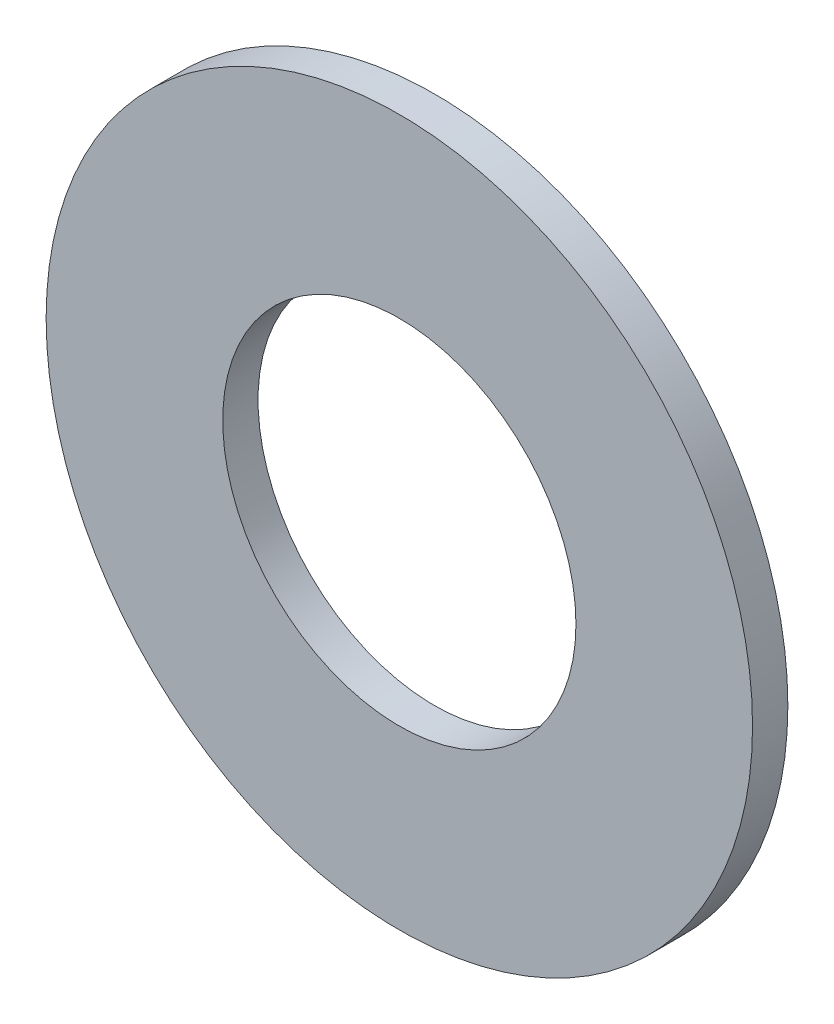
ISO-10303-21;
HEADER;
FILE_DESCRIPTION(('STEP AP214'),'2;1');
FILE_NAME('part.step','',(''),(''),'','','');
FILE_SCHEMA(('AUTOMOTIVE_DESIGN { 1 0 10303 214 1 1 1 1 }'));
ENDSEC;
DATA;
#1=APPLICATION_CONTEXT('core data for automotive mechanical design processes');
#2=APPLICATION_PROTOCOL_DEFINITION('international standard','automotive_design',2000,#1);
#3=PRODUCT_CONTEXT('',#1,'mechanical');
#4=PRODUCT('Part','Part','',(#3));
#5=PRODUCT_RELATED_PRODUCT_CATEGORY('part','',(#4));
#6=PRODUCT_DEFINITION_FORMATION('','',#4);
#7=PRODUCT_DEFINITION_CONTEXT('part definition',#1,'design');
#8=PRODUCT_DEFINITION('design','',#6,#7);
#9=PRODUCT_DEFINITION_SHAPE('','',#8);
#10=(LENGTH_UNIT() NAMED_UNIT(*) SI_UNIT(.MILLI.,.METRE.));
#11=(NAMED_UNIT(*) PLANE_ANGLE_UNIT() SI_UNIT($,.RADIAN.));
#12=(NAMED_UNIT(*) SI_UNIT($,.STERADIAN.) SOLID_ANGLE_UNIT());
#13=UNCERTAINTY_MEASURE_WITH_UNIT(LENGTH_MEASURE(1.E-05),#10,'distance_accuracy_value','');
#14=(GEOMETRIC_REPRESENTATION_CONTEXT(3) GLOBAL_UNCERTAINTY_ASSIGNED_CONTEXT((#13)) GLOBAL_UNIT_ASSIGNED_CONTEXT((#10,
#11,#12)) REPRESENTATION_CONTEXT('',''));
#15=CARTESIAN_POINT('',(0.,0.,0.));
#16=DIRECTION('',(0.,0.,1.));
#17=DIRECTION('',(1.,0.,0.));
#18=AXIS2_PLACEMENT_3D('',#15,#16,#17);
#19=CARTESIAN_POINT('',(0.,0.,2.));
#20=DIRECTION('',(0.,0.,1.));
#21=DIRECTION('',(1.,0.,0.));
#22=AXIS2_PLACEMENT_3D('',#19,#20,#21);
#23=PLANE('',#22);
#24=CARTESIAN_POINT('',(0.,0.,2.));
#25=DIRECTION('',(0.,0.,1.));
#26=DIRECTION('',(1.,0.,0.));
#27=AXIS2_PLACEMENT_3D('',#24,#25,#26);
#28=CIRCLE('',#27,20.);
#29=CARTESIAN_POINT('',(20.,0.,2.));
#30=VERTEX_POINT('',#29);
#31=EDGE_CURVE('E10',#30,#30,#28,.T.);
#32=ORIENTED_EDGE('',*,*,#31,.T.);
#33=EDGE_LOOP('',(#32));
#34=FACE_BOUND('',#33,.T.);
#35=CARTESIAN_POINT('',(0.,0.,2.));
#36=DIRECTION('',(0.,0.,1.));
#37=DIRECTION('',(1.,0.,0.));
#38=AXIS2_PLACEMENT_3D('',#35,#36,#37);
#39=CIRCLE('',#38,10.);
#40=CARTESIAN_POINT('',(10.,0.,2.));
#41=VERTEX_POINT('',#40);
#42=EDGE_CURVE('E41',#41,#41,#39,.T.);
#43=ORIENTED_EDGE('',*,*,#42,.F.);
#44=EDGE_LOOP('',(#43));
#45=FACE_BOUND('',#44,.T.);
#46=ADVANCED_FACE('F30',(#34,#45),#23,.T.);
#47=CARTESIAN_POINT('',(0.,0.,0.));
#48=DIRECTION('',(0.,0.,1.));
#49=DIRECTION('',(1.,0.,0.));
#50=AXIS2_PLACEMENT_3D('',#47,#48,#49);
#51=PLANE('',#50);
#52=CARTESIAN_POINT('',(0.,0.,0.));
#53=DIRECTION('',(0.,0.,1.));
#54=DIRECTION('',(1.,0.,0.));
#55=AXIS2_PLACEMENT_3D('',#52,#53,#54);
#56=CIRCLE('',#55,20.);
#57=CARTESIAN_POINT('',(20.,0.,0.));
#58=VERTEX_POINT('',#57);
#59=EDGE_CURVE('E34',#58,#58,#56,.T.);
#60=ORIENTED_EDGE('',*,*,#59,.F.);
#61=EDGE_LOOP('',(#60));
#62=FACE_BOUND('',#61,.T.);
#63=CARTESIAN_POINT('',(0.,0.,0.));
#64=DIRECTION('',(0.,0.,1.));
#65=DIRECTION('',(1.,0.,0.));
#66=AXIS2_PLACEMENT_3D('',#63,#64,#65);
#67=CIRCLE('',#66,10.);
#68=CARTESIAN_POINT('',(10.,0.,0.));
#69=VERTEX_POINT('',#68);
#70=EDGE_CURVE('E43',#69,#69,#67,.T.);
#71=ORIENTED_EDGE('',*,*,#70,.T.);
#72=EDGE_LOOP('',(#71));
#73=FACE_BOUND('',#72,.T.);
#74=ADVANCED_FACE('F53',(#62,#73),#51,.F.);
#75=CARTESIAN_POINT('',(0.,0.,2.));
#76=DIRECTION('',(0.,0.,-1.));
#77=DIRECTION('',(-1.,0.,0.));
#78=AXIS2_PLACEMENT_3D('',#75,#76,#77);
#79=CYLINDRICAL_SURFACE('',#78,20.);
#80=ORIENTED_EDGE('',*,*,#31,.F.);
#81=EDGE_LOOP('',(#80));
#82=FACE_BOUND('',#81,.T.);
#83=ORIENTED_EDGE('',*,*,#59,.T.);
#84=EDGE_LOOP('',(#83));
#85=FACE_BOUND('',#84,.T.);
#86=ADVANCED_FACE('F32',(#82,#85),#79,.T.);
#87=CARTESIAN_POINT('',(0.,0.,2.));
#88=DIRECTION('',(0.,0.,-1.));
#89=DIRECTION('',(-1.,0.,0.));
#90=AXIS2_PLACEMENT_3D('',#87,#88,#89);
#91=CYLINDRICAL_SURFACE('',#90,10.);
#92=ORIENTED_EDGE('',*,*,#42,.T.);
#93=EDGE_LOOP('',(#92));
#94=FACE_BOUND('',#93,.T.);
#95=ORIENTED_EDGE('',*,*,#70,.F.);
#96=EDGE_LOOP('',(#95));
#97=FACE_BOUND('',#96,.T.);
#98=ADVANCED_FACE('F49',(#94,#97),#91,.F.);
#99=CLOSED_SHELL('',(#46,#74,#86,#98));
#100=MANIFOLD_SOLID_BREP('B2',#99);
#101=ADVANCED_BREP_SHAPE_REPRESENTATION('',(#18,#100),#14);
#102=SHAPE_DEFINITION_REPRESENTATION(#9,#101);
ENDSEC;
END-ISO-10303-21;
